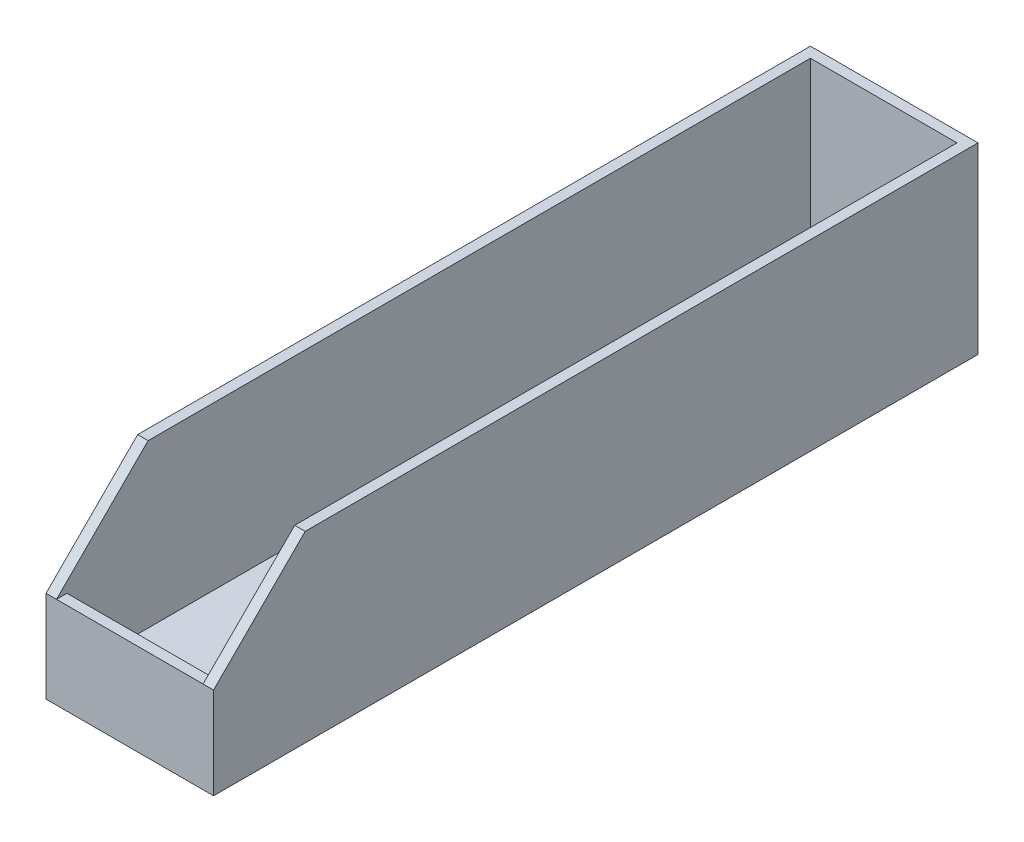
ISO-10303-21;
HEADER;
FILE_DESCRIPTION(('STEP AP214'),'2;1');
FILE_NAME('part.step','',(''),(''),'','','');
FILE_SCHEMA(('AUTOMOTIVE_DESIGN { 1 0 10303 214 1 1 1 1 }'));
ENDSEC;
DATA;
#1=APPLICATION_CONTEXT('core data for automotive mechanical design processes');
#2=APPLICATION_PROTOCOL_DEFINITION('international standard','automotive_design',2000,#1);
#3=PRODUCT_CONTEXT('',#1,'mechanical');
#4=PRODUCT('Part','Part','',(#3));
#5=PRODUCT_RELATED_PRODUCT_CATEGORY('part','',(#4));
#6=PRODUCT_DEFINITION_FORMATION('','',#4);
#7=PRODUCT_DEFINITION_CONTEXT('part definition',#1,'design');
#8=PRODUCT_DEFINITION('design','',#6,#7);
#9=PRODUCT_DEFINITION_SHAPE('','',#8);
#10=(LENGTH_UNIT() NAMED_UNIT(*) SI_UNIT(.MILLI.,.METRE.));
#11=(NAMED_UNIT(*) PLANE_ANGLE_UNIT() SI_UNIT($,.RADIAN.));
#12=(NAMED_UNIT(*) SI_UNIT($,.STERADIAN.) SOLID_ANGLE_UNIT());
#13=UNCERTAINTY_MEASURE_WITH_UNIT(LENGTH_MEASURE(1.E-05),#10,'distance_accuracy_value','');
#14=(GEOMETRIC_REPRESENTATION_CONTEXT(3) GLOBAL_UNCERTAINTY_ASSIGNED_CONTEXT((#13)) GLOBAL_UNIT_ASSIGNED_CONTEXT((#10,
#11,#12)) REPRESENTATION_CONTEXT('',''));
#15=CARTESIAN_POINT('',(0.,0.,0.));
#16=DIRECTION('',(0.,0.,1.));
#17=DIRECTION('',(1.,0.,0.));
#18=AXIS2_PLACEMENT_3D('',#15,#16,#17);
#19=CARTESIAN_POINT('',(0.,-0.00100000000000013,30.));
#20=DIRECTION('',(0.,1.,0.));
#21=DIRECTION('',(0.,0.,1.));
#22=AXIS2_PLACEMENT_3D('',#19,#20,#21);
#23=CYLINDRICAL_SURFACE('',#22,1.7);
#24=CARTESIAN_POINT('',(0.,0.,30.));
#25=DIRECTION('',(0.,1.,0.));
#26=DIRECTION('',(0.,0.,1.));
#27=AXIS2_PLACEMENT_3D('',#24,#25,#26);
#28=CIRCLE('',#27,1.7);
#29=CARTESIAN_POINT('',(0.,0.,31.7));
#30=VERTEX_POINT('',#29);
#31=EDGE_CURVE('E236',#30,#30,#28,.F.);
#32=ORIENTED_EDGE('',*,*,#31,.T.);
#33=EDGE_LOOP('',(#32));
#34=FACE_BOUND('',#33,.T.);
#35=CARTESIAN_POINT('',(0.,2.,30.));
#36=DIRECTION('',(0.,1.,0.));
#37=DIRECTION('',(0.,0.,1.));
#38=AXIS2_PLACEMENT_3D('',#35,#36,#37);
#39=CIRCLE('',#38,1.7);
#40=CARTESIAN_POINT('',(0.,2.,31.7));
#41=VERTEX_POINT('',#40);
#42=EDGE_CURVE('E229',#41,#41,#39,.T.);
#43=ORIENTED_EDGE('',*,*,#42,.T.);
#44=EDGE_LOOP('',(#43));
#45=FACE_BOUND('',#44,.T.);
#46=ADVANCED_FACE('F37',(#34,#45),#23,.F.);
#47=CARTESIAN_POINT('',(0.,-0.00100000000000013,-30.));
#48=DIRECTION('',(0.,1.,0.));
#49=DIRECTION('',(0.,0.,1.));
#50=AXIS2_PLACEMENT_3D('',#47,#48,#49);
#51=CYLINDRICAL_SURFACE('',#50,1.7);
#52=CARTESIAN_POINT('',(0.,0.,-30.));
#53=DIRECTION('',(0.,1.,0.));
#54=DIRECTION('',(0.,0.,1.));
#55=AXIS2_PLACEMENT_3D('',#52,#53,#54);
#56=CIRCLE('',#55,1.7);
#57=CARTESIAN_POINT('',(0.,0.,-28.3));
#58=VERTEX_POINT('',#57);
#59=EDGE_CURVE('E247',#58,#58,#56,.F.);
#60=ORIENTED_EDGE('',*,*,#59,.T.);
#61=EDGE_LOOP('',(#60));
#62=FACE_BOUND('',#61,.T.);
#63=CARTESIAN_POINT('',(0.,2.,-30.));
#64=DIRECTION('',(0.,1.,0.));
#65=DIRECTION('',(0.,0.,1.));
#66=AXIS2_PLACEMENT_3D('',#63,#64,#65);
#67=CIRCLE('',#66,1.7);
#68=CARTESIAN_POINT('',(0.,2.,-28.3));
#69=VERTEX_POINT('',#68);
#70=EDGE_CURVE('E239',#69,#69,#67,.T.);
#71=ORIENTED_EDGE('',*,*,#70,.T.);
#72=EDGE_LOOP('',(#71));
#73=FACE_BOUND('',#72,.T.);
#74=ADVANCED_FACE('F275',(#62,#73),#51,.F.);
#75=CARTESIAN_POINT('',(0.,4.,0.));
#76=DIRECTION('',(0.,1.,0.));
#77=DIRECTION('',(0.,0.,1.));
#78=AXIS2_PLACEMENT_3D('',#75,#76,#77);
#79=PLANE('',#78);
#80=CARTESIAN_POINT('',(0.,4.,30.));
#81=DIRECTION('',(0.,1.,0.));
#82=DIRECTION('',(0.,0.,1.));
#83=AXIS2_PLACEMENT_3D('',#80,#81,#82);
#84=CIRCLE('',#83,3.05);
#85=CARTESIAN_POINT('',(0.,4.,33.05));
#86=VERTEX_POINT('',#85);
#87=EDGE_CURVE('E233',#86,#86,#84,.T.);
#88=ORIENTED_EDGE('',*,*,#87,.F.);
#89=EDGE_LOOP('',(#88));
#90=FACE_BOUND('',#89,.T.);
#91=CARTESIAN_POINT('',(0.,4.,-30.));
#92=DIRECTION('',(0.,1.,0.));
#93=DIRECTION('',(0.,0.,1.));
#94=AXIS2_PLACEMENT_3D('',#91,#92,#93);
#95=CIRCLE('',#94,3.05);
#96=CARTESIAN_POINT('',(0.,4.,-26.95));
#97=VERTEX_POINT('',#96);
#98=EDGE_CURVE('E228',#97,#97,#95,.T.);
#99=ORIENTED_EDGE('',*,*,#98,.F.);
#100=EDGE_LOOP('',(#99));
#101=FACE_BOUND('',#100,.T.);
#102=DIRECTION('',(0.,0.,1.));
#103=VECTOR('',#102,1.);
#104=CARTESIAN_POINT('',(14.,4.,0.));
#105=LINE('',#104,#103);
#106=CARTESIAN_POINT('',(14.,4.,-71.));
#107=VERTEX_POINT('',#106);
#108=CARTESIAN_POINT('',(14.,4.,71.));
#109=VERTEX_POINT('',#108);
#110=EDGE_CURVE('E158',#107,#109,#105,.T.);
#111=ORIENTED_EDGE('',*,*,#110,.F.);
#112=DIRECTION('',(1.,0.,0.));
#113=VECTOR('',#112,1.);
#114=CARTESIAN_POINT('',(0.,4.,-71.));
#115=LINE('',#114,#113);
#116=CARTESIAN_POINT('',(-14.,4.,-71.));
#117=VERTEX_POINT('',#116);
#118=EDGE_CURVE('E160',#117,#107,#115,.T.);
#119=ORIENTED_EDGE('',*,*,#118,.F.);
#120=DIRECTION('',(0.,0.,1.));
#121=VECTOR('',#120,1.);
#122=CARTESIAN_POINT('',(-14.,4.,0.));
#123=LINE('',#122,#121);
#124=CARTESIAN_POINT('',(-14.,4.,71.));
#125=VERTEX_POINT('',#124);
#126=EDGE_CURVE('E45',#117,#125,#123,.T.);
#127=ORIENTED_EDGE('',*,*,#126,.T.);
#128=DIRECTION('',(1.,0.,0.));
#129=VECTOR('',#128,1.);
#130=CARTESIAN_POINT('',(0.,4.,71.));
#131=LINE('',#130,#129);
#132=EDGE_CURVE('E11',#125,#109,#131,.T.);
#133=ORIENTED_EDGE('',*,*,#132,.T.);
#134=EDGE_LOOP('',(#111,#119,#127,#133));
#135=FACE_BOUND('',#134,.T.);
#136=ADVANCED_FACE('F166',(#90,#101,#135),#79,.T.);
#137=CARTESIAN_POINT('',(0.,0.,0.));
#138=DIRECTION('',(0.,1.,0.));
#139=DIRECTION('',(0.,0.,1.));
#140=AXIS2_PLACEMENT_3D('',#137,#138,#139);
#141=PLANE('',#140);
#142=ORIENTED_EDGE('',*,*,#59,.F.);
#143=EDGE_LOOP('',(#142));
#144=FACE_BOUND('',#143,.T.);
#145=ORIENTED_EDGE('',*,*,#31,.F.);
#146=EDGE_LOOP('',(#145));
#147=FACE_BOUND('',#146,.T.);
#148=DIRECTION('',(1.,0.,0.));
#149=VECTOR('',#148,1.);
#150=CARTESIAN_POINT('',(0.,0.,73.));
#151=LINE('',#150,#149);
#152=CARTESIAN_POINT('',(-16.,0.,73.));
#153=VERTEX_POINT('',#152);
#154=CARTESIAN_POINT('',(16.,0.,73.));
#155=VERTEX_POINT('',#154);
#156=EDGE_CURVE('E180',#153,#155,#151,.T.);
#157=ORIENTED_EDGE('',*,*,#156,.F.);
#158=DIRECTION('',(0.,0.,1.));
#159=VECTOR('',#158,1.);
#160=CARTESIAN_POINT('',(-16.,0.,0.));
#161=LINE('',#160,#159);
#162=CARTESIAN_POINT('',(-16.,0.,-73.));
#163=VERTEX_POINT('',#162);
#164=EDGE_CURVE('E144',#163,#153,#161,.T.);
#165=ORIENTED_EDGE('',*,*,#164,.F.);
#166=DIRECTION('',(1.,0.,0.));
#167=VECTOR('',#166,1.);
#168=CARTESIAN_POINT('',(0.,0.,-73.));
#169=LINE('',#168,#167);
#170=CARTESIAN_POINT('',(16.,0.,-73.));
#171=VERTEX_POINT('',#170);
#172=EDGE_CURVE('E205',#163,#171,#169,.T.);
#173=ORIENTED_EDGE('',*,*,#172,.T.);
#174=DIRECTION('',(0.,0.,1.));
#175=VECTOR('',#174,1.);
#176=CARTESIAN_POINT('',(16.,0.,0.));
#177=LINE('',#176,#175);
#178=EDGE_CURVE('E182',#171,#155,#177,.T.);
#179=ORIENTED_EDGE('',*,*,#178,.T.);
#180=EDGE_LOOP('',(#157,#165,#173,#179));
#181=FACE_BOUND('',#180,.T.);
#182=ADVANCED_FACE('F39',(#144,#147,#181),#141,.F.);
#183=CARTESIAN_POINT('',(14.,35.,0.));
#184=DIRECTION('',(1.,0.,0.));
#185=DIRECTION('',(0.,0.,-1.));
#186=AXIS2_PLACEMENT_3D('',#183,#184,#185);
#187=PLANE('',#186);
#188=DIRECTION('',(0.,0.,1.));
#189=VECTOR('',#188,1.);
#190=CARTESIAN_POINT('',(14.,17.5,0.));
#191=LINE('',#190,#189);
#192=CARTESIAN_POINT('',(14.,17.5,71.));
#193=VERTEX_POINT('',#192);
#194=CARTESIAN_POINT('',(14.,17.5,73.));
#195=VERTEX_POINT('',#194);
#196=EDGE_CURVE('E250',#193,#195,#191,.T.);
#197=ORIENTED_EDGE('',*,*,#196,.T.);
#198=DIRECTION('',(0.,0.707106781186548,-0.707106781186548));
#199=VECTOR('',#198,1.);
#200=CARTESIAN_POINT('',(14.,62.75,27.75));
#201=LINE('',#200,#199);
#202=CARTESIAN_POINT('',(14.,35.,55.5));
#203=VERTEX_POINT('',#202);
#204=EDGE_CURVE('E223',#195,#203,#201,.T.);
#205=ORIENTED_EDGE('',*,*,#204,.T.);
#206=DIRECTION('',(0.,0.,1.));
#207=VECTOR('',#206,1.);
#208=CARTESIAN_POINT('',(14.,35.,0.));
#209=LINE('',#208,#207);
#210=CARTESIAN_POINT('',(14.,35.,-71.));
#211=VERTEX_POINT('',#210);
#212=EDGE_CURVE('E187',#211,#203,#209,.T.);
#213=ORIENTED_EDGE('',*,*,#212,.F.);
#214=DIRECTION('',(0.,-1.,0.));
#215=VECTOR('',#214,1.);
#216=CARTESIAN_POINT('',(14.,35.,-71.));
#217=LINE('',#216,#215);
#218=EDGE_CURVE('E151',#211,#107,#217,.T.);
#219=ORIENTED_EDGE('',*,*,#218,.T.);
#220=ORIENTED_EDGE('',*,*,#110,.T.);
#221=DIRECTION('',(0.,-1.,0.));
#222=VECTOR('',#221,1.);
#223=CARTESIAN_POINT('',(14.,17.5,71.));
#224=LINE('',#223,#222);
#225=EDGE_CURVE('E175',#193,#109,#224,.T.);
#226=ORIENTED_EDGE('',*,*,#225,.F.);
#227=EDGE_LOOP('',(#197,#205,#213,#219,#220,#226));
#228=FACE_BOUND('',#227,.T.);
#229=ADVANCED_FACE('F211',(#228),#187,.F.);
#230=CARTESIAN_POINT('',(-14.,35.,0.));
#231=DIRECTION('',(1.,0.,0.));
#232=DIRECTION('',(0.,0.,-1.));
#233=AXIS2_PLACEMENT_3D('',#230,#231,#232);
#234=PLANE('',#233);
#235=DIRECTION('',(0.,0.707106781186548,-0.707106781186548));
#236=VECTOR('',#235,1.);
#237=CARTESIAN_POINT('',(-14.,62.75,27.75));
#238=LINE('',#237,#236);
#239=CARTESIAN_POINT('',(-14.,17.5,73.));
#240=VERTEX_POINT('',#239);
#241=CARTESIAN_POINT('',(-14.,35.,55.5));
#242=VERTEX_POINT('',#241);
#243=EDGE_CURVE('E52',#240,#242,#238,.T.);
#244=ORIENTED_EDGE('',*,*,#243,.F.);
#245=DIRECTION('',(0.,0.,1.));
#246=VECTOR('',#245,1.);
#247=CARTESIAN_POINT('',(-14.,17.5,0.));
#248=LINE('',#247,#246);
#249=CARTESIAN_POINT('',(-14.,17.5,71.));
#250=VERTEX_POINT('',#249);
#251=EDGE_CURVE('E255',#250,#240,#248,.T.);
#252=ORIENTED_EDGE('',*,*,#251,.F.);
#253=DIRECTION('',(0.,-1.,0.));
#254=VECTOR('',#253,1.);
#255=CARTESIAN_POINT('',(-14.,17.5,71.));
#256=LINE('',#255,#254);
#257=EDGE_CURVE('E173',#250,#125,#256,.T.);
#258=ORIENTED_EDGE('',*,*,#257,.T.);
#259=ORIENTED_EDGE('',*,*,#126,.F.);
#260=DIRECTION('',(0.,-1.,0.));
#261=VECTOR('',#260,1.);
#262=CARTESIAN_POINT('',(-14.,35.,-71.));
#263=LINE('',#262,#261);
#264=CARTESIAN_POINT('',(-14.,35.,-71.));
#265=VERTEX_POINT('',#264);
#266=EDGE_CURVE('E146',#265,#117,#263,.T.);
#267=ORIENTED_EDGE('',*,*,#266,.F.);
#268=DIRECTION('',(0.,0.,1.));
#269=VECTOR('',#268,1.);
#270=CARTESIAN_POINT('',(-14.,35.,0.));
#271=LINE('',#270,#269);
#272=EDGE_CURVE('E198',#265,#242,#271,.T.);
#273=ORIENTED_EDGE('',*,*,#272,.T.);
#274=EDGE_LOOP('',(#244,#252,#258,#259,#267,#273));
#275=FACE_BOUND('',#274,.T.);
#276=ADVANCED_FACE('F217',(#275),#234,.T.);
#277=CARTESIAN_POINT('',(0.,35.,73.));
#278=DIRECTION('',(0.,0.,-1.));
#279=DIRECTION('',(-1.,0.,0.));
#280=AXIS2_PLACEMENT_3D('',#277,#278,#279);
#281=PLANE('',#280);
#282=DIRECTION('',(0.,-1.,0.));
#283=VECTOR('',#282,1.);
#284=CARTESIAN_POINT('',(16.,35.,73.));
#285=LINE('',#284,#283);
#286=CARTESIAN_POINT('',(16.,17.5,73.));
#287=VERTEX_POINT('',#286);
#288=EDGE_CURVE('E156',#287,#155,#285,.T.);
#289=ORIENTED_EDGE('',*,*,#288,.F.);
#290=DIRECTION('',(1.,0.,0.));
#291=VECTOR('',#290,1.);
#292=CARTESIAN_POINT('',(-16.,17.5,73.));
#293=LINE('',#292,#291);
#294=EDGE_CURVE('E127',#195,#287,#293,.T.);
#295=ORIENTED_EDGE('',*,*,#294,.F.);
#296=DIRECTION('',(1.,0.,0.));
#297=VECTOR('',#296,1.);
#298=CARTESIAN_POINT('',(0.,17.5,73.));
#299=LINE('',#298,#297);
#300=EDGE_CURVE('E138',#240,#195,#299,.T.);
#301=ORIENTED_EDGE('',*,*,#300,.F.);
#302=CARTESIAN_POINT('',(-16.,17.5,73.));
#303=VERTEX_POINT('',#302);
#304=EDGE_CURVE('E121',#303,#240,#293,.T.);
#305=ORIENTED_EDGE('',*,*,#304,.F.);
#306=DIRECTION('',(0.,-1.,0.));
#307=VECTOR('',#306,1.);
#308=CARTESIAN_POINT('',(-16.,35.,73.));
#309=LINE('',#308,#307);
#310=EDGE_CURVE('E134',#303,#153,#309,.T.);
#311=ORIENTED_EDGE('',*,*,#310,.T.);
#312=ORIENTED_EDGE('',*,*,#156,.T.);
#313=EDGE_LOOP('',(#289,#295,#301,#305,#311,#312));
#314=FACE_BOUND('',#313,.T.);
#315=ADVANCED_FACE('F132',(#314),#281,.F.);
#316=CARTESIAN_POINT('',(16.,35.,0.));
#317=DIRECTION('',(1.,0.,0.));
#318=DIRECTION('',(0.,0.,-1.));
#319=AXIS2_PLACEMENT_3D('',#316,#317,#318);
#320=PLANE('',#319);
#321=DIRECTION('',(0.,0.707106781186548,-0.707106781186548));
#322=VECTOR('',#321,1.);
#323=CARTESIAN_POINT('',(16.,17.5,73.));
#324=LINE('',#323,#322);
#325=CARTESIAN_POINT('',(16.,35.,55.5));
#326=VERTEX_POINT('',#325);
#327=EDGE_CURVE('E60',#287,#326,#324,.T.);
#328=ORIENTED_EDGE('',*,*,#327,.F.);
#329=ORIENTED_EDGE('',*,*,#288,.T.);
#330=ORIENTED_EDGE('',*,*,#178,.F.);
#331=DIRECTION('',(0.,-1.,0.));
#332=VECTOR('',#331,1.);
#333=CARTESIAN_POINT('',(16.,35.,-73.));
#334=LINE('',#333,#332);
#335=CARTESIAN_POINT('',(16.,35.,-73.));
#336=VERTEX_POINT('',#335);
#337=EDGE_CURVE('E148',#336,#171,#334,.T.);
#338=ORIENTED_EDGE('',*,*,#337,.F.);
#339=DIRECTION('',(0.,0.,1.));
#340=VECTOR('',#339,1.);
#341=CARTESIAN_POINT('',(16.,35.,0.));
#342=LINE('',#341,#340);
#343=EDGE_CURVE('E190',#336,#326,#342,.T.);
#344=ORIENTED_EDGE('',*,*,#343,.T.);
#345=EDGE_LOOP('',(#328,#329,#330,#338,#344));
#346=FACE_BOUND('',#345,.T.);
#347=ADVANCED_FACE('F260',(#346),#320,.T.);
#348=CARTESIAN_POINT('',(0.,35.,-73.));
#349=DIRECTION('',(0.,0.,-1.));
#350=DIRECTION('',(-1.,0.,0.));
#351=AXIS2_PLACEMENT_3D('',#348,#349,#350);
#352=PLANE('',#351);
#353=ORIENTED_EDGE('',*,*,#172,.F.);
#354=DIRECTION('',(0.,-1.,0.));
#355=VECTOR('',#354,1.);
#356=CARTESIAN_POINT('',(-16.,35.,-73.));
#357=LINE('',#356,#355);
#358=CARTESIAN_POINT('',(-16.,35.,-73.));
#359=VERTEX_POINT('',#358);
#360=EDGE_CURVE('E145',#359,#163,#357,.T.);
#361=ORIENTED_EDGE('',*,*,#360,.F.);
#362=DIRECTION('',(1.,0.,0.));
#363=VECTOR('',#362,1.);
#364=CARTESIAN_POINT('',(0.,35.,-73.));
#365=LINE('',#364,#363);
#366=EDGE_CURVE('E193',#359,#336,#365,.T.);
#367=ORIENTED_EDGE('',*,*,#366,.T.);
#368=ORIENTED_EDGE('',*,*,#337,.T.);
#369=EDGE_LOOP('',(#353,#361,#367,#368));
#370=FACE_BOUND('',#369,.T.);
#371=ADVANCED_FACE('F264',(#370),#352,.T.);
#372=CARTESIAN_POINT('',(-16.,35.,0.));
#373=DIRECTION('',(1.,0.,0.));
#374=DIRECTION('',(0.,0.,-1.));
#375=AXIS2_PLACEMENT_3D('',#372,#373,#374);
#376=PLANE('',#375);
#377=ORIENTED_EDGE('',*,*,#310,.F.);
#378=DIRECTION('',(0.,0.707106781186548,-0.707106781186548));
#379=VECTOR('',#378,1.);
#380=CARTESIAN_POINT('',(-16.,17.5,73.));
#381=LINE('',#380,#379);
#382=CARTESIAN_POINT('',(-16.,35.,55.5));
#383=VERTEX_POINT('',#382);
#384=EDGE_CURVE('E118',#303,#383,#381,.T.);
#385=ORIENTED_EDGE('',*,*,#384,.T.);
#386=DIRECTION('',(0.,0.,1.));
#387=VECTOR('',#386,1.);
#388=CARTESIAN_POINT('',(-16.,35.,0.));
#389=LINE('',#388,#387);
#390=EDGE_CURVE('E196',#359,#383,#389,.T.);
#391=ORIENTED_EDGE('',*,*,#390,.F.);
#392=ORIENTED_EDGE('',*,*,#360,.T.);
#393=ORIENTED_EDGE('',*,*,#164,.T.);
#394=EDGE_LOOP('',(#377,#385,#391,#392,#393));
#395=FACE_BOUND('',#394,.T.);
#396=ADVANCED_FACE('F142',(#395),#376,.F.);
#397=CARTESIAN_POINT('',(0.,35.,-71.));
#398=DIRECTION('',(0.,0.,-1.));
#399=DIRECTION('',(-1.,0.,0.));
#400=AXIS2_PLACEMENT_3D('',#397,#398,#399);
#401=PLANE('',#400);
#402=ORIENTED_EDGE('',*,*,#118,.T.);
#403=ORIENTED_EDGE('',*,*,#218,.F.);
#404=DIRECTION('',(1.,0.,0.));
#405=VECTOR('',#404,1.);
#406=CARTESIAN_POINT('',(0.,35.,-71.));
#407=LINE('',#406,#405);
#408=EDGE_CURVE('E201',#265,#211,#407,.T.);
#409=ORIENTED_EDGE('',*,*,#408,.F.);
#410=ORIENTED_EDGE('',*,*,#266,.T.);
#411=EDGE_LOOP('',(#402,#403,#409,#410));
#412=FACE_BOUND('',#411,.T.);
#413=ADVANCED_FACE('F215',(#412),#401,.F.);
#414=CARTESIAN_POINT('',(0.,35.,0.));
#415=DIRECTION('',(0.,1.,0.));
#416=DIRECTION('',(0.,0.,1.));
#417=AXIS2_PLACEMENT_3D('',#414,#415,#416);
#418=PLANE('',#417);
#419=DIRECTION('',(1.,0.,0.));
#420=VECTOR('',#419,1.);
#421=CARTESIAN_POINT('',(-16.,35.,55.5));
#422=LINE('',#421,#420);
#423=EDGE_CURVE('E139',#203,#326,#422,.T.);
#424=ORIENTED_EDGE('',*,*,#423,.T.);
#425=ORIENTED_EDGE('',*,*,#343,.F.);
#426=ORIENTED_EDGE('',*,*,#366,.F.);
#427=ORIENTED_EDGE('',*,*,#390,.T.);
#428=EDGE_CURVE('E122',#383,#242,#422,.T.);
#429=ORIENTED_EDGE('',*,*,#428,.T.);
#430=ORIENTED_EDGE('',*,*,#272,.F.);
#431=ORIENTED_EDGE('',*,*,#408,.T.);
#432=ORIENTED_EDGE('',*,*,#212,.T.);
#433=EDGE_LOOP('',(#424,#425,#426,#427,#429,#430,#431,#432));
#434=FACE_BOUND('',#433,.T.);
#435=ADVANCED_FACE('F220',(#434),#418,.T.);
#436=CARTESIAN_POINT('',(0.,17.5,71.));
#437=DIRECTION('',(0.,0.,-1.));
#438=DIRECTION('',(-1.,0.,0.));
#439=AXIS2_PLACEMENT_3D('',#436,#437,#438);
#440=PLANE('',#439);
#441=ORIENTED_EDGE('',*,*,#225,.T.);
#442=ORIENTED_EDGE('',*,*,#132,.F.);
#443=ORIENTED_EDGE('',*,*,#257,.F.);
#444=DIRECTION('',(1.,0.,0.));
#445=VECTOR('',#444,1.);
#446=CARTESIAN_POINT('',(0.,17.5,71.));
#447=LINE('',#446,#445);
#448=EDGE_CURVE('E176',#250,#193,#447,.T.);
#449=ORIENTED_EDGE('',*,*,#448,.T.);
#450=EDGE_LOOP('',(#441,#442,#443,#449));
#451=FACE_BOUND('',#450,.T.);
#452=ADVANCED_FACE('F171',(#451),#440,.T.);
#453=CARTESIAN_POINT('',(0.,17.5,0.));
#454=DIRECTION('',(0.,1.,0.));
#455=DIRECTION('',(0.,0.,1.));
#456=AXIS2_PLACEMENT_3D('',#453,#454,#455);
#457=PLANE('',#456);
#458=ORIENTED_EDGE('',*,*,#196,.F.);
#459=ORIENTED_EDGE('',*,*,#448,.F.);
#460=ORIENTED_EDGE('',*,*,#251,.T.);
#461=ORIENTED_EDGE('',*,*,#300,.T.);
#462=EDGE_LOOP('',(#458,#459,#460,#461));
#463=FACE_BOUND('',#462,.T.);
#464=ADVANCED_FACE('F257',(#463),#457,.T.);
#465=CARTESIAN_POINT('',(0.,2.,-30.));
#466=DIRECTION('',(0.,1.,0.));
#467=DIRECTION('',(0.,0.,1.));
#468=AXIS2_PLACEMENT_3D('',#465,#466,#467);
#469=CYLINDRICAL_SURFACE('',#468,3.05);
#470=CARTESIAN_POINT('',(0.,2.,-30.));
#471=DIRECTION('',(0.,1.,0.));
#472=DIRECTION('',(0.,0.,1.));
#473=AXIS2_PLACEMENT_3D('',#470,#471,#472);
#474=CIRCLE('',#473,3.05);
#475=CARTESIAN_POINT('',(0.,2.,-26.95));
#476=VERTEX_POINT('',#475);
#477=EDGE_CURVE('E240',#476,#476,#474,.T.);
#478=ORIENTED_EDGE('',*,*,#477,.F.);
#479=EDGE_LOOP('',(#478));
#480=FACE_BOUND('',#479,.T.);
#481=ORIENTED_EDGE('',*,*,#98,.T.);
#482=EDGE_LOOP('',(#481));
#483=FACE_BOUND('',#482,.T.);
#484=ADVANCED_FACE('F288',(#480,#483),#469,.F.);
#485=CARTESIAN_POINT('',(0.,2.,0.));
#486=DIRECTION('',(0.,1.,0.));
#487=DIRECTION('',(0.,0.,1.));
#488=AXIS2_PLACEMENT_3D('',#485,#486,#487);
#489=PLANE('',#488);
#490=ORIENTED_EDGE('',*,*,#477,.T.);
#491=EDGE_LOOP('',(#490));
#492=FACE_BOUND('',#491,.T.);
#493=ORIENTED_EDGE('',*,*,#70,.F.);
#494=EDGE_LOOP('',(#493));
#495=FACE_BOUND('',#494,.T.);
#496=ADVANCED_FACE('F317',(#492,#495),#489,.T.);
#497=CARTESIAN_POINT('',(0.,2.,30.));
#498=DIRECTION('',(0.,1.,0.));
#499=DIRECTION('',(0.,0.,1.));
#500=AXIS2_PLACEMENT_3D('',#497,#498,#499);
#501=CYLINDRICAL_SURFACE('',#500,3.05);
#502=CARTESIAN_POINT('',(0.,2.,30.));
#503=DIRECTION('',(0.,1.,0.));
#504=DIRECTION('',(0.,0.,1.));
#505=AXIS2_PLACEMENT_3D('',#502,#503,#504);
#506=CIRCLE('',#505,3.05);
#507=CARTESIAN_POINT('',(0.,2.,33.05));
#508=VERTEX_POINT('',#507);
#509=EDGE_CURVE('E232',#508,#508,#506,.T.);
#510=ORIENTED_EDGE('',*,*,#509,.F.);
#511=EDGE_LOOP('',(#510));
#512=FACE_BOUND('',#511,.T.);
#513=ORIENTED_EDGE('',*,*,#87,.T.);
#514=EDGE_LOOP('',(#513));
#515=FACE_BOUND('',#514,.T.);
#516=ADVANCED_FACE('F322',(#512,#515),#501,.F.);
#517=CARTESIAN_POINT('',(0.,2.,0.));
#518=DIRECTION('',(0.,1.,0.));
#519=DIRECTION('',(0.,0.,1.));
#520=AXIS2_PLACEMENT_3D('',#517,#518,#519);
#521=PLANE('',#520);
#522=ORIENTED_EDGE('',*,*,#42,.F.);
#523=EDGE_LOOP('',(#522));
#524=FACE_BOUND('',#523,.T.);
#525=ORIENTED_EDGE('',*,*,#509,.T.);
#526=EDGE_LOOP('',(#525));
#527=FACE_BOUND('',#526,.T.);
#528=ADVANCED_FACE('F272',(#524,#527),#521,.T.);
#529=CARTESIAN_POINT('',(-16.,17.5,73.));
#530=DIRECTION('',(0.,-0.707106781186547,-0.707106781186547));
#531=DIRECTION('',(0.,0.707106781186548,-0.707106781186548));
#532=AXIS2_PLACEMENT_3D('',#529,#530,#531);
#533=PLANE('',#532);
#534=ORIENTED_EDGE('',*,*,#243,.T.);
#535=ORIENTED_EDGE('',*,*,#428,.F.);
#536=ORIENTED_EDGE('',*,*,#384,.F.);
#537=ORIENTED_EDGE('',*,*,#304,.T.);
#538=EDGE_LOOP('',(#534,#535,#536,#537));
#539=FACE_BOUND('',#538,.T.);
#540=ADVANCED_FACE('F120',(#539),#533,.F.);
#541=ORIENTED_EDGE('',*,*,#294,.T.);
#542=ORIENTED_EDGE('',*,*,#327,.T.);
#543=ORIENTED_EDGE('',*,*,#423,.F.);
#544=ORIENTED_EDGE('',*,*,#204,.F.);
#545=EDGE_LOOP('',(#541,#542,#543,#544));
#546=FACE_BOUND('',#545,.T.);
#547=ADVANCED_FACE('F266',(#546),#533,.F.);
#548=CLOSED_SHELL('',(#46,#74,#136,#182,#229,#276,#315,#347,#371,#396,#413,#435,#452,#464,#484,
#496,#516,#528,#540,#547));
#549=MANIFOLD_SOLID_BREP('B2',#548);
#550=ADVANCED_BREP_SHAPE_REPRESENTATION('',(#18,#549),#14);
#551=SHAPE_DEFINITION_REPRESENTATION(#9,#550);
ENDSEC;
END-ISO-10303-21;
